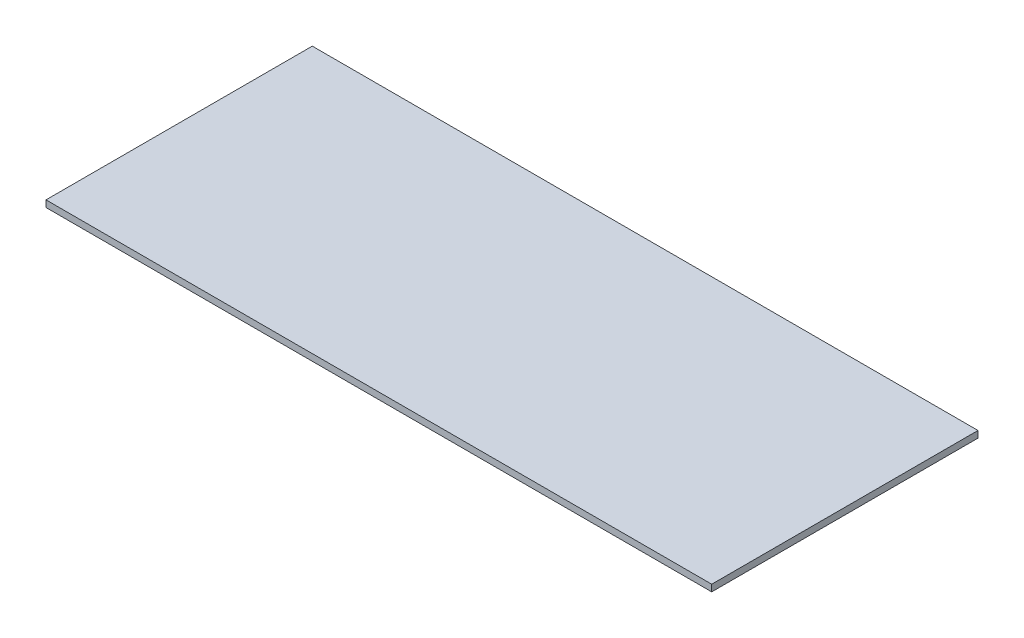
ISO-10303-21;
HEADER;
FILE_DESCRIPTION(('STEP AP214'),'2;1');
FILE_NAME('part.step','',(''),(''),'','','');
FILE_SCHEMA(('AUTOMOTIVE_DESIGN { 1 0 10303 214 1 1 1 1 }'));
ENDSEC;
DATA;
#1=APPLICATION_CONTEXT('core data for automotive mechanical design processes');
#2=APPLICATION_PROTOCOL_DEFINITION('international standard','automotive_design',2000,#1);
#3=PRODUCT_CONTEXT('',#1,'mechanical');
#4=PRODUCT('Part','Part','',(#3));
#5=PRODUCT_RELATED_PRODUCT_CATEGORY('part','',(#4));
#6=PRODUCT_DEFINITION_FORMATION('','',#4);
#7=PRODUCT_DEFINITION_CONTEXT('part definition',#1,'design');
#8=PRODUCT_DEFINITION('design','',#6,#7);
#9=PRODUCT_DEFINITION_SHAPE('','',#8);
#10=(LENGTH_UNIT() NAMED_UNIT(*) SI_UNIT(.MILLI.,.METRE.));
#11=(NAMED_UNIT(*) PLANE_ANGLE_UNIT() SI_UNIT($,.RADIAN.));
#12=(NAMED_UNIT(*) SI_UNIT($,.STERADIAN.) SOLID_ANGLE_UNIT());
#13=UNCERTAINTY_MEASURE_WITH_UNIT(LENGTH_MEASURE(1.E-05),#10,'distance_accuracy_value','');
#14=(GEOMETRIC_REPRESENTATION_CONTEXT(3) GLOBAL_UNCERTAINTY_ASSIGNED_CONTEXT((#13)) GLOBAL_UNIT_ASSIGNED_CONTEXT((#10,
#11,#12)) REPRESENTATION_CONTEXT('',''));
#15=CARTESIAN_POINT('',(0.,0.,0.));
#16=DIRECTION('',(0.,0.,1.));
#17=DIRECTION('',(1.,0.,0.));
#18=AXIS2_PLACEMENT_3D('',#15,#16,#17);
#19=CARTESIAN_POINT('',(2500.,50.,-1000.));
#20=DIRECTION('',(-1.,0.,0.));
#21=DIRECTION('',(0.,0.,1.));
#22=AXIS2_PLACEMENT_3D('',#19,#20,#21);
#23=PLANE('',#22);
#24=DIRECTION('',(0.,0.,-1.));
#25=VECTOR('',#24,1.);
#26=CARTESIAN_POINT('',(2500.,0.,-1000.));
#27=LINE('',#26,#25);
#28=CARTESIAN_POINT('',(2500.,0.,1000.));
#29=VERTEX_POINT('',#28);
#30=CARTESIAN_POINT('',(2500.,0.,-1000.));
#31=VERTEX_POINT('',#30);
#32=EDGE_CURVE('E96',#29,#31,#27,.T.);
#33=ORIENTED_EDGE('',*,*,#32,.T.);
#34=DIRECTION('',(0.,-1.,0.));
#35=VECTOR('',#34,1.);
#36=CARTESIAN_POINT('',(2500.,50.,-1000.));
#37=LINE('',#36,#35);
#38=CARTESIAN_POINT('',(2500.,50.,-1000.));
#39=VERTEX_POINT('',#38);
#40=EDGE_CURVE('E11',#39,#31,#37,.T.);
#41=ORIENTED_EDGE('',*,*,#40,.F.);
#42=DIRECTION('',(0.,0.,-1.));
#43=VECTOR('',#42,1.);
#44=CARTESIAN_POINT('',(2500.,50.,-1000.));
#45=LINE('',#44,#43);
#46=CARTESIAN_POINT('',(2500.,50.,1000.));
#47=VERTEX_POINT('',#46);
#48=EDGE_CURVE('E84',#47,#39,#45,.T.);
#49=ORIENTED_EDGE('',*,*,#48,.F.);
#50=DIRECTION('',(0.,-1.,0.));
#51=VECTOR('',#50,1.);
#52=CARTESIAN_POINT('',(2500.,50.,1000.));
#53=LINE('',#52,#51);
#54=EDGE_CURVE('E92',#47,#29,#53,.T.);
#55=ORIENTED_EDGE('',*,*,#54,.T.);
#56=EDGE_LOOP('',(#33,#41,#49,#55));
#57=FACE_BOUND('',#56,.T.);
#58=ADVANCED_FACE('F33',(#57),#23,.F.);
#59=CARTESIAN_POINT('',(-2500.,50.,-1000.));
#60=DIRECTION('',(0.,0.,1.));
#61=DIRECTION('',(1.,0.,0.));
#62=AXIS2_PLACEMENT_3D('',#59,#60,#61);
#63=PLANE('',#62);
#64=DIRECTION('',(-1.,0.,0.));
#65=VECTOR('',#64,1.);
#66=CARTESIAN_POINT('',(-2500.,0.,-1000.));
#67=LINE('',#66,#65);
#68=CARTESIAN_POINT('',(-2500.,0.,-1000.));
#69=VERTEX_POINT('',#68);
#70=EDGE_CURVE('E88',#31,#69,#67,.T.);
#71=ORIENTED_EDGE('',*,*,#70,.T.);
#72=DIRECTION('',(0.,-1.,0.));
#73=VECTOR('',#72,1.);
#74=CARTESIAN_POINT('',(-2500.,50.,-1000.));
#75=LINE('',#74,#73);
#76=CARTESIAN_POINT('',(-2500.,50.,-1000.));
#77=VERTEX_POINT('',#76);
#78=EDGE_CURVE('E41',#77,#69,#75,.T.);
#79=ORIENTED_EDGE('',*,*,#78,.F.);
#80=DIRECTION('',(-1.,0.,0.));
#81=VECTOR('',#80,1.);
#82=CARTESIAN_POINT('',(-2500.,50.,-1000.));
#83=LINE('',#82,#81);
#84=EDGE_CURVE('E79',#39,#77,#83,.T.);
#85=ORIENTED_EDGE('',*,*,#84,.F.);
#86=ORIENTED_EDGE('',*,*,#40,.T.);
#87=EDGE_LOOP('',(#71,#79,#85,#86));
#88=FACE_BOUND('',#87,.T.);
#89=ADVANCED_FACE('F87',(#88),#63,.F.);
#90=CARTESIAN_POINT('',(-2500.,50.,-1000.));
#91=DIRECTION('',(1.,0.,0.));
#92=DIRECTION('',(0.,0.,-1.));
#93=AXIS2_PLACEMENT_3D('',#90,#91,#92);
#94=PLANE('',#93);
#95=DIRECTION('',(0.,0.,1.));
#96=VECTOR('',#95,1.);
#97=CARTESIAN_POINT('',(-2500.,0.,-1000.));
#98=LINE('',#97,#96);
#99=CARTESIAN_POINT('',(-2500.,0.,1000.));
#100=VERTEX_POINT('',#99);
#101=EDGE_CURVE('E66',#69,#100,#98,.T.);
#102=ORIENTED_EDGE('',*,*,#101,.T.);
#103=DIRECTION('',(0.,-1.,0.));
#104=VECTOR('',#103,1.);
#105=CARTESIAN_POINT('',(-2500.,50.,1000.));
#106=LINE('',#105,#104);
#107=CARTESIAN_POINT('',(-2500.,50.,1000.));
#108=VERTEX_POINT('',#107);
#109=EDGE_CURVE('E89',#108,#100,#106,.T.);
#110=ORIENTED_EDGE('',*,*,#109,.F.);
#111=DIRECTION('',(0.,0.,1.));
#112=VECTOR('',#111,1.);
#113=CARTESIAN_POINT('',(-2500.,50.,-1000.));
#114=LINE('',#113,#112);
#115=EDGE_CURVE('E82',#77,#108,#114,.T.);
#116=ORIENTED_EDGE('',*,*,#115,.F.);
#117=ORIENTED_EDGE('',*,*,#78,.T.);
#118=EDGE_LOOP('',(#102,#110,#116,#117));
#119=FACE_BOUND('',#118,.T.);
#120=ADVANCED_FACE('F90',(#119),#94,.F.);
#121=CARTESIAN_POINT('',(-2500.,50.,1000.));
#122=DIRECTION('',(0.,0.,-1.));
#123=DIRECTION('',(-1.,0.,0.));
#124=AXIS2_PLACEMENT_3D('',#121,#122,#123);
#125=PLANE('',#124);
#126=DIRECTION('',(1.,0.,0.));
#127=VECTOR('',#126,1.);
#128=CARTESIAN_POINT('',(-2500.,0.,1000.));
#129=LINE('',#128,#127);
#130=EDGE_CURVE('E72',#100,#29,#129,.T.);
#131=ORIENTED_EDGE('',*,*,#130,.T.);
#132=ORIENTED_EDGE('',*,*,#54,.F.);
#133=DIRECTION('',(1.,0.,0.));
#134=VECTOR('',#133,1.);
#135=CARTESIAN_POINT('',(-2500.,50.,1000.));
#136=LINE('',#135,#134);
#137=EDGE_CURVE('E49',#108,#47,#136,.T.);
#138=ORIENTED_EDGE('',*,*,#137,.F.);
#139=ORIENTED_EDGE('',*,*,#109,.T.);
#140=EDGE_LOOP('',(#131,#132,#138,#139));
#141=FACE_BOUND('',#140,.T.);
#142=ADVANCED_FACE('F103',(#141),#125,.F.);
#143=CARTESIAN_POINT('',(0.,50.,0.));
#144=DIRECTION('',(0.,1.,0.));
#145=DIRECTION('',(0.,0.,1.));
#146=AXIS2_PLACEMENT_3D('',#143,#144,#145);
#147=PLANE('',#146);
#148=ORIENTED_EDGE('',*,*,#48,.T.);
#149=ORIENTED_EDGE('',*,*,#84,.T.);
#150=ORIENTED_EDGE('',*,*,#115,.T.);
#151=ORIENTED_EDGE('',*,*,#137,.T.);
#152=EDGE_LOOP('',(#148,#149,#150,#151));
#153=FACE_BOUND('',#152,.T.);
#154=ADVANCED_FACE('F80',(#153),#147,.T.);
#155=CARTESIAN_POINT('',(0.,0.,0.));
#156=DIRECTION('',(0.,1.,0.));
#157=DIRECTION('',(0.,0.,1.));
#158=AXIS2_PLACEMENT_3D('',#155,#156,#157);
#159=PLANE('',#158);
#160=ORIENTED_EDGE('',*,*,#32,.F.);
#161=ORIENTED_EDGE('',*,*,#130,.F.);
#162=ORIENTED_EDGE('',*,*,#101,.F.);
#163=ORIENTED_EDGE('',*,*,#70,.F.);
#164=EDGE_LOOP('',(#160,#161,#162,#163));
#165=FACE_BOUND('',#164,.T.);
#166=ADVANCED_FACE('F106',(#165),#159,.F.);
#167=CLOSED_SHELL('',(#58,#89,#120,#142,#154,#166));
#168=MANIFOLD_SOLID_BREP('B2',#167);
#169=ADVANCED_BREP_SHAPE_REPRESENTATION('',(#18,#168),#14);
#170=SHAPE_DEFINITION_REPRESENTATION(#9,#169);
ENDSEC;
END-ISO-10303-21;
